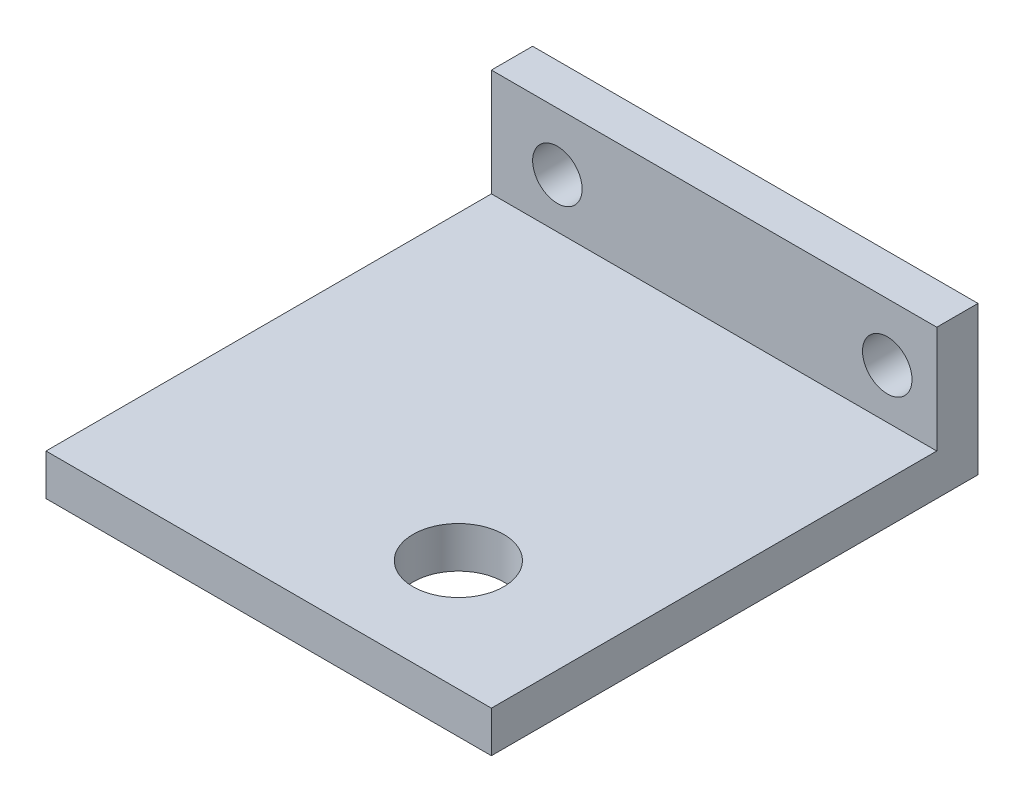
ISO-10303-21;
HEADER;
FILE_DESCRIPTION(('STEP AP214'),'2;1');
FILE_NAME('part.step','',(''),(''),'','','');
FILE_SCHEMA(('AUTOMOTIVE_DESIGN { 1 0 10303 214 1 1 1 1 }'));
ENDSEC;
DATA;
#1=APPLICATION_CONTEXT('core data for automotive mechanical design processes');
#2=APPLICATION_PROTOCOL_DEFINITION('international standard','automotive_design',2000,#1);
#3=PRODUCT_CONTEXT('',#1,'mechanical');
#4=PRODUCT('Part','Part','',(#3));
#5=PRODUCT_RELATED_PRODUCT_CATEGORY('part','',(#4));
#6=PRODUCT_DEFINITION_FORMATION('','',#4);
#7=PRODUCT_DEFINITION_CONTEXT('part definition',#1,'design');
#8=PRODUCT_DEFINITION('design','',#6,#7);
#9=PRODUCT_DEFINITION_SHAPE('','',#8);
#10=(LENGTH_UNIT() NAMED_UNIT(*) SI_UNIT(.MILLI.,.METRE.));
#11=(NAMED_UNIT(*) PLANE_ANGLE_UNIT() SI_UNIT($,.RADIAN.));
#12=(NAMED_UNIT(*) SI_UNIT($,.STERADIAN.) SOLID_ANGLE_UNIT());
#13=UNCERTAINTY_MEASURE_WITH_UNIT(LENGTH_MEASURE(1.E-05),#10,'distance_accuracy_value','');
#14=(GEOMETRIC_REPRESENTATION_CONTEXT(3) GLOBAL_UNCERTAINTY_ASSIGNED_CONTEXT((#13)) GLOBAL_UNIT_ASSIGNED_CONTEXT((#10,
#11,#12)) REPRESENTATION_CONTEXT('',''));
#15=CARTESIAN_POINT('',(0.,0.,0.));
#16=DIRECTION('',(0.,0.,1.));
#17=DIRECTION('',(1.,0.,0.));
#18=AXIS2_PLACEMENT_3D('',#15,#16,#17);
#19=CARTESIAN_POINT('',(0.,0.,59.));
#20=DIRECTION('',(0.,0.,-1.));
#21=DIRECTION('',(-1.,0.,0.));
#22=AXIS2_PLACEMENT_3D('',#19,#20,#21);
#23=PLANE('',#22);
#24=DIRECTION('',(1.,0.,0.));
#25=VECTOR('',#24,1.);
#26=CARTESIAN_POINT('',(0.,-4.,59.));
#27=LINE('',#26,#25);
#28=CARTESIAN_POINT('',(-27.,-4.,59.));
#29=VERTEX_POINT('',#28);
#30=CARTESIAN_POINT('',(27.,-4.,59.));
#31=VERTEX_POINT('',#30);
#32=EDGE_CURVE('E133',#29,#31,#27,.T.);
#33=ORIENTED_EDGE('',*,*,#32,.F.);
#34=DIRECTION('',(0.,-1.,0.));
#35=VECTOR('',#34,1.);
#36=CARTESIAN_POINT('',(-27.,-8.99999999999999,59.));
#37=LINE('',#36,#35);
#38=CARTESIAN_POINT('',(-27.,-8.99999999999999,59.));
#39=VERTEX_POINT('',#38);
#40=EDGE_CURVE('E140',#29,#39,#37,.T.);
#41=ORIENTED_EDGE('',*,*,#40,.T.);
#42=DIRECTION('',(1.,0.,0.));
#43=VECTOR('',#42,1.);
#44=CARTESIAN_POINT('',(-27.,-8.99999999999999,59.));
#45=LINE('',#44,#43);
#46=CARTESIAN_POINT('',(27.,-8.99999999999999,59.));
#47=VERTEX_POINT('',#46);
#48=EDGE_CURVE('E56',#39,#47,#45,.T.);
#49=ORIENTED_EDGE('',*,*,#48,.T.);
#50=DIRECTION('',(0.,1.,0.));
#51=VECTOR('',#50,1.);
#52=CARTESIAN_POINT('',(27.,-8.99999999999999,59.));
#53=LINE('',#52,#51);
#54=EDGE_CURVE('E85',#47,#31,#53,.T.);
#55=ORIENTED_EDGE('',*,*,#54,.T.);
#56=EDGE_LOOP('',(#33,#41,#49,#55));
#57=FACE_BOUND('',#56,.T.);
#58=ADVANCED_FACE('F33',(#57),#23,.F.);
#59=CARTESIAN_POINT('',(0.,0.,0.));
#60=DIRECTION('',(0.,0.,-1.));
#61=DIRECTION('',(-1.,0.,0.));
#62=AXIS2_PLACEMENT_3D('',#59,#60,#61);
#63=PLANE('',#62);
#64=CARTESIAN_POINT('',(-19.,2.,0.));
#65=DIRECTION('',(0.,0.,1.));
#66=DIRECTION('',(1.,0.,0.));
#67=AXIS2_PLACEMENT_3D('',#64,#65,#66);
#68=CIRCLE('',#67,3.);
#69=CARTESIAN_POINT('',(-16.,2.,0.));
#70=VERTEX_POINT('',#69);
#71=EDGE_CURVE('E99',#70,#70,#68,.T.);
#72=ORIENTED_EDGE('',*,*,#71,.T.);
#73=EDGE_LOOP('',(#72));
#74=FACE_BOUND('',#73,.T.);
#75=DIRECTION('',(0.,1.,0.));
#76=VECTOR('',#75,1.);
#77=CARTESIAN_POINT('',(27.,-8.99999999999999,0.));
#78=LINE('',#77,#76);
#79=CARTESIAN_POINT('',(27.,-8.99999999999999,0.));
#80=VERTEX_POINT('',#79);
#81=CARTESIAN_POINT('',(27.,9.,0.));
#82=VERTEX_POINT('',#81);
#83=EDGE_CURVE('E91',#80,#82,#78,.T.);
#84=ORIENTED_EDGE('',*,*,#83,.F.);
#85=DIRECTION('',(1.,0.,0.));
#86=VECTOR('',#85,1.);
#87=CARTESIAN_POINT('',(-27.,-8.99999999999999,0.));
#88=LINE('',#87,#86);
#89=CARTESIAN_POINT('',(-27.,-8.99999999999999,0.));
#90=VERTEX_POINT('',#89);
#91=EDGE_CURVE('E75',#90,#80,#88,.T.);
#92=ORIENTED_EDGE('',*,*,#91,.F.);
#93=DIRECTION('',(0.,-1.,0.));
#94=VECTOR('',#93,1.);
#95=CARTESIAN_POINT('',(-27.,-8.99999999999999,0.));
#96=LINE('',#95,#94);
#97=CARTESIAN_POINT('',(-27.,9.,0.));
#98=VERTEX_POINT('',#97);
#99=EDGE_CURVE('E86',#98,#90,#96,.T.);
#100=ORIENTED_EDGE('',*,*,#99,.F.);
#101=DIRECTION('',(-1.,0.,0.));
#102=VECTOR('',#101,1.);
#103=CARTESIAN_POINT('',(-27.,9.,0.));
#104=LINE('',#103,#102);
#105=EDGE_CURVE('E98',#82,#98,#104,.T.);
#106=ORIENTED_EDGE('',*,*,#105,.F.);
#107=EDGE_LOOP('',(#84,#92,#100,#106));
#108=FACE_BOUND('',#107,.T.);
#109=CARTESIAN_POINT('',(21.,2.,0.));
#110=DIRECTION('',(0.,0.,1.));
#111=DIRECTION('',(1.,0.,0.));
#112=AXIS2_PLACEMENT_3D('',#109,#110,#111);
#113=CIRCLE('',#112,3.);
#114=CARTESIAN_POINT('',(24.,2.,0.));
#115=VERTEX_POINT('',#114);
#116=EDGE_CURVE('E103',#115,#115,#113,.T.);
#117=ORIENTED_EDGE('',*,*,#116,.T.);
#118=EDGE_LOOP('',(#117));
#119=FACE_BOUND('',#118,.T.);
#120=ADVANCED_FACE('F95',(#74,#108,#119),#63,.T.);
#121=CARTESIAN_POINT('',(27.,-8.99999999999999,59.));
#122=DIRECTION('',(-1.,0.,0.));
#123=DIRECTION('',(0.,0.,1.));
#124=AXIS2_PLACEMENT_3D('',#121,#122,#123);
#125=PLANE('',#124);
#126=DIRECTION('',(0.,0.,-1.));
#127=VECTOR('',#126,1.);
#128=CARTESIAN_POINT('',(27.,9.,59.));
#129=LINE('',#128,#127);
#130=CARTESIAN_POINT('',(27.,9.,5.));
#131=VERTEX_POINT('',#130);
#132=EDGE_CURVE('E41',#131,#82,#129,.T.);
#133=ORIENTED_EDGE('',*,*,#132,.F.);
#134=DIRECTION('',(0.,-1.,0.));
#135=VECTOR('',#134,1.);
#136=CARTESIAN_POINT('',(27.,-8.99999999999999,5.));
#137=LINE('',#136,#135);
#138=CARTESIAN_POINT('',(27.,-4.,5.));
#139=VERTEX_POINT('',#138);
#140=EDGE_CURVE('E130',#131,#139,#137,.T.);
#141=ORIENTED_EDGE('',*,*,#140,.T.);
#142=DIRECTION('',(0.,0.,-1.));
#143=VECTOR('',#142,1.);
#144=CARTESIAN_POINT('',(27.,-4.,59.));
#145=LINE('',#144,#143);
#146=EDGE_CURVE('E136',#31,#139,#145,.T.);
#147=ORIENTED_EDGE('',*,*,#146,.F.);
#148=ORIENTED_EDGE('',*,*,#54,.F.);
#149=DIRECTION('',(0.,0.,-1.));
#150=VECTOR('',#149,1.);
#151=CARTESIAN_POINT('',(27.,-8.99999999999999,59.));
#152=LINE('',#151,#150);
#153=EDGE_CURVE('E78',#47,#80,#152,.T.);
#154=ORIENTED_EDGE('',*,*,#153,.T.);
#155=ORIENTED_EDGE('',*,*,#83,.T.);
#156=EDGE_LOOP('',(#133,#141,#147,#148,#154,#155));
#157=FACE_BOUND('',#156,.T.);
#158=ADVANCED_FACE('F35',(#157),#125,.F.);
#159=CARTESIAN_POINT('',(-27.,9.,59.));
#160=DIRECTION('',(0.,-1.,0.));
#161=DIRECTION('',(0.,0.,-1.));
#162=AXIS2_PLACEMENT_3D('',#159,#160,#161);
#163=PLANE('',#162);
#164=DIRECTION('',(0.,0.,-1.));
#165=VECTOR('',#164,1.);
#166=CARTESIAN_POINT('',(-27.,9.,59.));
#167=LINE('',#166,#165);
#168=CARTESIAN_POINT('',(-27.,9.,5.));
#169=VERTEX_POINT('',#168);
#170=EDGE_CURVE('E110',#169,#98,#167,.T.);
#171=ORIENTED_EDGE('',*,*,#170,.F.);
#172=DIRECTION('',(-1.,0.,0.));
#173=VECTOR('',#172,1.);
#174=CARTESIAN_POINT('',(42.5059230736906,9.,5.));
#175=LINE('',#174,#173);
#176=EDGE_CURVE('E120',#131,#169,#175,.T.);
#177=ORIENTED_EDGE('',*,*,#176,.F.);
#178=ORIENTED_EDGE('',*,*,#132,.T.);
#179=ORIENTED_EDGE('',*,*,#105,.T.);
#180=EDGE_LOOP('',(#171,#177,#178,#179));
#181=FACE_BOUND('',#180,.T.);
#182=ADVANCED_FACE('F151',(#181),#163,.F.);
#183=CARTESIAN_POINT('',(-27.,-8.99999999999999,59.));
#184=DIRECTION('',(1.,0.,0.));
#185=DIRECTION('',(0.,0.,-1.));
#186=AXIS2_PLACEMENT_3D('',#183,#184,#185);
#187=PLANE('',#186);
#188=DIRECTION('',(0.,0.,1.));
#189=VECTOR('',#188,1.);
#190=CARTESIAN_POINT('',(-27.,-4.,59.));
#191=LINE('',#190,#189);
#192=CARTESIAN_POINT('',(-27.,-4.,5.));
#193=VERTEX_POINT('',#192);
#194=EDGE_CURVE('E11',#193,#29,#191,.T.);
#195=ORIENTED_EDGE('',*,*,#194,.F.);
#196=DIRECTION('',(0.,1.,0.));
#197=VECTOR('',#196,1.);
#198=CARTESIAN_POINT('',(-27.,-8.99999999999999,5.));
#199=LINE('',#198,#197);
#200=EDGE_CURVE('E118',#193,#169,#199,.T.);
#201=ORIENTED_EDGE('',*,*,#200,.T.);
#202=ORIENTED_EDGE('',*,*,#170,.T.);
#203=ORIENTED_EDGE('',*,*,#99,.T.);
#204=DIRECTION('',(0.,0.,-1.));
#205=VECTOR('',#204,1.);
#206=CARTESIAN_POINT('',(-27.,-8.99999999999999,59.));
#207=LINE('',#206,#205);
#208=EDGE_CURVE('E81',#39,#90,#207,.T.);
#209=ORIENTED_EDGE('',*,*,#208,.F.);
#210=ORIENTED_EDGE('',*,*,#40,.F.);
#211=EDGE_LOOP('',(#195,#201,#202,#203,#209,#210));
#212=FACE_BOUND('',#211,.T.);
#213=ADVANCED_FACE('F146',(#212),#187,.F.);
#214=CARTESIAN_POINT('',(-27.,-8.99999999999999,59.));
#215=DIRECTION('',(0.,1.,0.));
#216=DIRECTION('',(0.,0.,1.));
#217=AXIS2_PLACEMENT_3D('',#214,#215,#216);
#218=PLANE('',#217);
#219=CARTESIAN_POINT('',(9.50000000141893,-8.99999999999999,45.5022105001855));
#220=DIRECTION('',(0.,1.,0.));
#221=DIRECTION('',(0.,0.,1.));
#222=AXIS2_PLACEMENT_3D('',#219,#220,#221);
#223=CIRCLE('',#222,5.5);
#224=CARTESIAN_POINT('',(9.50000000141893,-8.99999999999999,51.0022105001855));
#225=VERTEX_POINT('',#224);
#226=EDGE_CURVE('E123',#225,#225,#223,.T.);
#227=ORIENTED_EDGE('',*,*,#226,.T.);
#228=EDGE_LOOP('',(#227));
#229=FACE_BOUND('',#228,.T.);
#230=ORIENTED_EDGE('',*,*,#91,.T.);
#231=ORIENTED_EDGE('',*,*,#153,.F.);
#232=ORIENTED_EDGE('',*,*,#48,.F.);
#233=ORIENTED_EDGE('',*,*,#208,.T.);
#234=EDGE_LOOP('',(#230,#231,#232,#233));
#235=FACE_BOUND('',#234,.T.);
#236=ADVANCED_FACE('F77',(#229,#235),#218,.F.);
#237=CARTESIAN_POINT('',(-19.,2.,59.));
#238=DIRECTION('',(0.,0.,-1.));
#239=DIRECTION('',(-1.,0.,0.));
#240=AXIS2_PLACEMENT_3D('',#237,#238,#239);
#241=CYLINDRICAL_SURFACE('',#240,3.);
#242=CARTESIAN_POINT('',(-19.,2.,5.));
#243=DIRECTION('',(0.,0.,-1.));
#244=DIRECTION('',(-1.,0.,0.));
#245=AXIS2_PLACEMENT_3D('',#242,#243,#244);
#246=CIRCLE('',#245,3.);
#247=CARTESIAN_POINT('',(-22.,2.,5.));
#248=VERTEX_POINT('',#247);
#249=EDGE_CURVE('E114',#248,#248,#246,.T.);
#250=ORIENTED_EDGE('',*,*,#249,.F.);
#251=EDGE_LOOP('',(#250));
#252=FACE_BOUND('',#251,.T.);
#253=ORIENTED_EDGE('',*,*,#71,.F.);
#254=EDGE_LOOP('',(#253));
#255=FACE_BOUND('',#254,.T.);
#256=ADVANCED_FACE('F184',(#252,#255),#241,.F.);
#257=CARTESIAN_POINT('',(21.,2.,59.));
#258=DIRECTION('',(0.,0.,-1.));
#259=DIRECTION('',(-1.,0.,0.));
#260=AXIS2_PLACEMENT_3D('',#257,#258,#259);
#261=CYLINDRICAL_SURFACE('',#260,3.);
#262=CARTESIAN_POINT('',(21.,2.,5.));
#263=DIRECTION('',(0.,0.,-1.));
#264=DIRECTION('',(-1.,0.,0.));
#265=AXIS2_PLACEMENT_3D('',#262,#263,#264);
#266=CIRCLE('',#265,3.);
#267=CARTESIAN_POINT('',(18.,2.,5.));
#268=VERTEX_POINT('',#267);
#269=EDGE_CURVE('E112',#268,#268,#266,.T.);
#270=ORIENTED_EDGE('',*,*,#269,.F.);
#271=EDGE_LOOP('',(#270));
#272=FACE_BOUND('',#271,.T.);
#273=ORIENTED_EDGE('',*,*,#116,.F.);
#274=EDGE_LOOP('',(#273));
#275=FACE_BOUND('',#274,.T.);
#276=ADVANCED_FACE('F172',(#272,#275),#261,.F.);
#277=CARTESIAN_POINT('',(0.,-4.,0.));
#278=DIRECTION('',(0.,1.,0.));
#279=DIRECTION('',(0.,0.,1.));
#280=AXIS2_PLACEMENT_3D('',#277,#278,#279);
#281=PLANE('',#280);
#282=CARTESIAN_POINT('',(9.50000000141893,-4.,45.5022105001855));
#283=DIRECTION('',(0.,1.,0.));
#284=DIRECTION('',(0.,0.,1.));
#285=AXIS2_PLACEMENT_3D('',#282,#283,#284);
#286=CIRCLE('',#285,5.49999999999999);
#287=CARTESIAN_POINT('',(9.50000000141893,-4.,51.0022105001855));
#288=VERTEX_POINT('',#287);
#289=EDGE_CURVE('E265',#288,#288,#286,.T.);
#290=ORIENTED_EDGE('',*,*,#289,.F.);
#291=EDGE_LOOP('',(#290));
#292=FACE_BOUND('',#291,.T.);
#293=ORIENTED_EDGE('',*,*,#146,.T.);
#294=DIRECTION('',(-1.,0.,0.));
#295=VECTOR('',#294,1.);
#296=CARTESIAN_POINT('',(42.5059230736906,-4.,5.));
#297=LINE('',#296,#295);
#298=EDGE_CURVE('E47',#139,#193,#297,.T.);
#299=ORIENTED_EDGE('',*,*,#298,.T.);
#300=ORIENTED_EDGE('',*,*,#194,.T.);
#301=ORIENTED_EDGE('',*,*,#32,.T.);
#302=EDGE_LOOP('',(#293,#299,#300,#301));
#303=FACE_BOUND('',#302,.T.);
#304=ADVANCED_FACE('F160',(#292,#303),#281,.T.);
#305=CARTESIAN_POINT('',(42.5059230736906,-4.,5.));
#306=DIRECTION('',(0.,0.,-1.));
#307=DIRECTION('',(-1.,0.,0.));
#308=AXIS2_PLACEMENT_3D('',#305,#306,#307);
#309=PLANE('',#308);
#310=ORIENTED_EDGE('',*,*,#249,.T.);
#311=EDGE_LOOP('',(#310));
#312=FACE_BOUND('',#311,.T.);
#313=ORIENTED_EDGE('',*,*,#269,.T.);
#314=EDGE_LOOP('',(#313));
#315=FACE_BOUND('',#314,.T.);
#316=ORIENTED_EDGE('',*,*,#176,.T.);
#317=ORIENTED_EDGE('',*,*,#200,.F.);
#318=ORIENTED_EDGE('',*,*,#298,.F.);
#319=ORIENTED_EDGE('',*,*,#140,.F.);
#320=EDGE_LOOP('',(#316,#317,#318,#319));
#321=FACE_BOUND('',#320,.T.);
#322=ADVANCED_FACE('F161',(#312,#315,#321),#309,.F.);
#323=CARTESIAN_POINT('',(9.50000000141893,-4.,45.5022105001855));
#324=DIRECTION('',(0.,1.,0.));
#325=DIRECTION('',(0.,0.,1.));
#326=AXIS2_PLACEMENT_3D('',#323,#324,#325);
#327=CYLINDRICAL_SURFACE('',#326,5.49999999999999);
#328=ORIENTED_EDGE('',*,*,#226,.F.);
#329=EDGE_LOOP('',(#328));
#330=FACE_BOUND('',#329,.T.);
#331=ORIENTED_EDGE('',*,*,#289,.T.);
#332=EDGE_LOOP('',(#331));
#333=FACE_BOUND('',#332,.T.);
#334=ADVANCED_FACE('F163',(#330,#333),#327,.F.);
#335=CLOSED_SHELL('',(#58,#120,#158,#182,#213,#236,#256,#276,#304,#322,#334));
#336=MANIFOLD_SOLID_BREP('B2',#335);
#337=ADVANCED_BREP_SHAPE_REPRESENTATION('',(#18,#336),#14);
#338=SHAPE_DEFINITION_REPRESENTATION(#9,#337);
ENDSEC;
END-ISO-10303-21;
